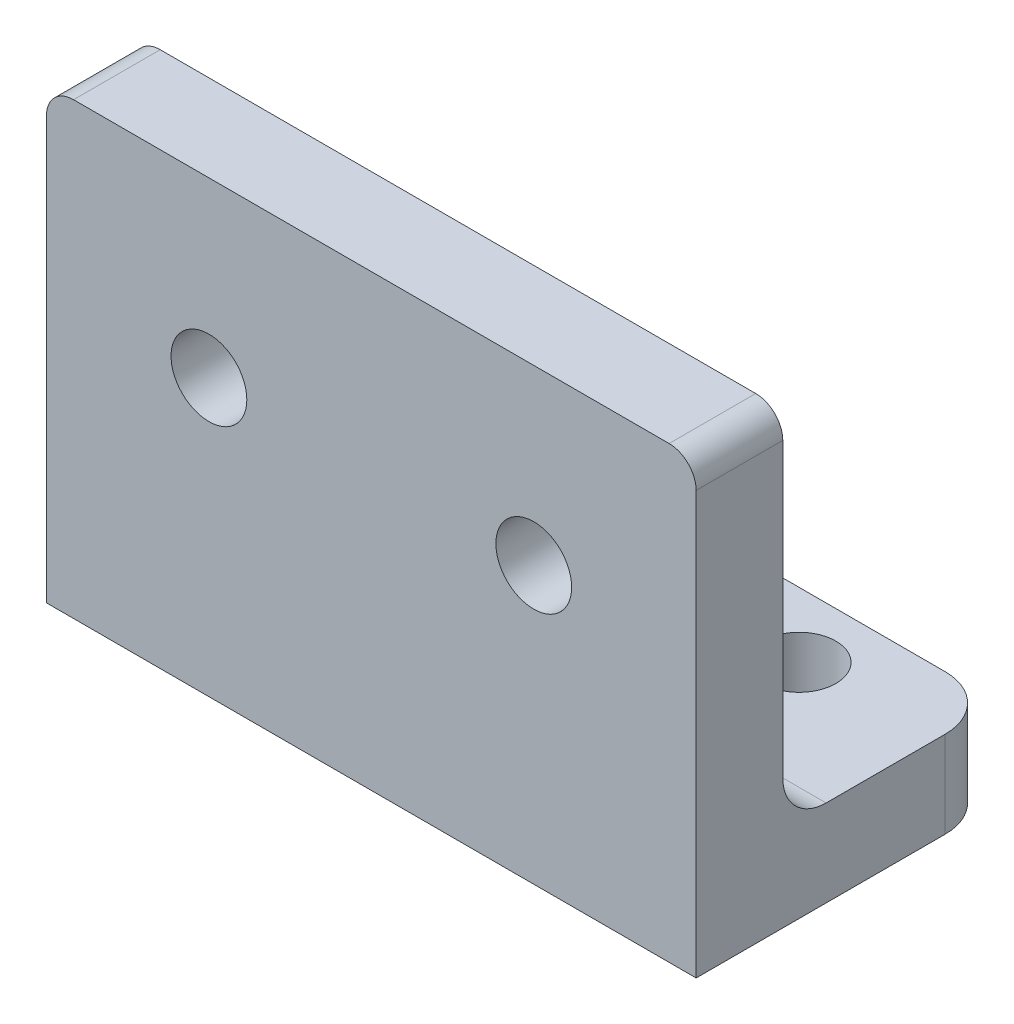
ISO-10303-21;
HEADER;
FILE_DESCRIPTION(('STEP AP214'),'2;1');
FILE_NAME('part.step','',(''),(''),'','','');
FILE_SCHEMA(('AUTOMOTIVE_DESIGN { 1 0 10303 214 1 1 1 1 }'));
ENDSEC;
DATA;
#1=APPLICATION_CONTEXT('core data for automotive mechanical design processes');
#2=APPLICATION_PROTOCOL_DEFINITION('international standard','automotive_design',2000,#1);
#3=PRODUCT_CONTEXT('',#1,'mechanical');
#4=PRODUCT('Part','Part','',(#3));
#5=PRODUCT_RELATED_PRODUCT_CATEGORY('part','',(#4));
#6=PRODUCT_DEFINITION_FORMATION('','',#4);
#7=PRODUCT_DEFINITION_CONTEXT('part definition',#1,'design');
#8=PRODUCT_DEFINITION('design','',#6,#7);
#9=PRODUCT_DEFINITION_SHAPE('','',#8);
#10=(LENGTH_UNIT() NAMED_UNIT(*) SI_UNIT(.MILLI.,.METRE.));
#11=(NAMED_UNIT(*) PLANE_ANGLE_UNIT() SI_UNIT($,.RADIAN.));
#12=(NAMED_UNIT(*) SI_UNIT($,.STERADIAN.) SOLID_ANGLE_UNIT());
#13=UNCERTAINTY_MEASURE_WITH_UNIT(LENGTH_MEASURE(1.E-05),#10,'distance_accuracy_value','');
#14=(GEOMETRIC_REPRESENTATION_CONTEXT(3) GLOBAL_UNCERTAINTY_ASSIGNED_CONTEXT((#13)) GLOBAL_UNIT_ASSIGNED_CONTEXT((#10,
#11,#12)) REPRESENTATION_CONTEXT('',''));
#15=CARTESIAN_POINT('',(0.,0.,0.));
#16=DIRECTION('',(0.,0.,1.));
#17=DIRECTION('',(1.,0.,0.));
#18=AXIS2_PLACEMENT_3D('',#15,#16,#17);
#19=CARTESIAN_POINT('',(0.,0.,0.));
#20=DIRECTION('',(0.,0.,1.));
#21=DIRECTION('',(1.,0.,0.));
#22=AXIS2_PLACEMENT_3D('',#19,#20,#21);
#23=PLANE('',#22);
#24=CARTESIAN_POINT('',(7.49999999999999,2.37499999999999,0.));
#25=DIRECTION('',(0.,0.,1.));
#26=DIRECTION('',(1.,0.,0.));
#27=AXIS2_PLACEMENT_3D('',#24,#25,#26);
#28=CIRCLE('',#27,1.75);
#29=CARTESIAN_POINT('',(9.24999999999999,2.37499999999999,0.));
#30=VERTEX_POINT('',#29);
#31=EDGE_CURVE('E186',#30,#30,#28,.T.);
#32=ORIENTED_EDGE('',*,*,#31,.T.);
#33=EDGE_LOOP('',(#32));
#34=FACE_BOUND('',#33,.T.);
#35=CARTESIAN_POINT('',(-7.49999999999701,2.37499999999999,0.));
#36=DIRECTION('',(0.,0.,1.));
#37=DIRECTION('',(1.,0.,0.));
#38=AXIS2_PLACEMENT_3D('',#35,#36,#37);
#39=CIRCLE('',#38,1.75);
#40=CARTESIAN_POINT('',(-5.74999999999701,2.37499999999999,0.));
#41=VERTEX_POINT('',#40);
#42=EDGE_CURVE('E163',#41,#41,#39,.T.);
#43=ORIENTED_EDGE('',*,*,#42,.T.);
#44=EDGE_LOOP('',(#43));
#45=FACE_BOUND('',#44,.T.);
#46=DIRECTION('',(0.,1.,0.));
#47=VECTOR('',#46,1.);
#48=CARTESIAN_POINT('',(15.,10.375,0.));
#49=LINE('',#48,#47);
#50=CARTESIAN_POINT('',(15.,-4.375,0.));
#51=VERTEX_POINT('',#50);
#52=CARTESIAN_POINT('',(15.,9.125,0.));
#53=VERTEX_POINT('',#52);
#54=EDGE_CURVE('E160',#51,#53,#49,.T.);
#55=ORIENTED_EDGE('',*,*,#54,.F.);
#56=DIRECTION('',(1.,0.,0.));
#57=VECTOR('',#56,1.);
#58=CARTESIAN_POINT('',(-15.,-4.375,0.));
#59=LINE('',#58,#57);
#60=CARTESIAN_POINT('',(-15.,-4.375,0.));
#61=VERTEX_POINT('',#60);
#62=EDGE_CURVE('E66',#51,#61,#59,.F.);
#63=ORIENTED_EDGE('',*,*,#62,.T.);
#64=DIRECTION('',(0.,-1.,0.));
#65=VECTOR('',#64,1.);
#66=CARTESIAN_POINT('',(-15.,10.375,0.));
#67=LINE('',#66,#65);
#68=CARTESIAN_POINT('',(-15.,9.125,0.));
#69=VERTEX_POINT('',#68);
#70=EDGE_CURVE('E166',#69,#61,#67,.T.);
#71=ORIENTED_EDGE('',*,*,#70,.F.);
#72=CARTESIAN_POINT('',(-13.75,9.125,0.));
#73=DIRECTION('',(0.,0.,1.));
#74=DIRECTION('',(1.,0.,0.));
#75=AXIS2_PLACEMENT_3D('',#72,#73,#74);
#76=CIRCLE('',#75,1.25);
#77=CARTESIAN_POINT('',(-13.75,10.375,0.));
#78=VERTEX_POINT('',#77);
#79=EDGE_CURVE('E173',#69,#78,#76,.F.);
#80=ORIENTED_EDGE('',*,*,#79,.T.);
#81=DIRECTION('',(-1.,0.,0.));
#82=VECTOR('',#81,1.);
#83=CARTESIAN_POINT('',(-15.,10.375,0.));
#84=LINE('',#83,#82);
#85=CARTESIAN_POINT('',(13.75,10.375,0.));
#86=VERTEX_POINT('',#85);
#87=EDGE_CURVE('E162',#86,#78,#84,.T.);
#88=ORIENTED_EDGE('',*,*,#87,.F.);
#89=CARTESIAN_POINT('',(13.75,9.125,0.));
#90=DIRECTION('',(0.,0.,1.));
#91=DIRECTION('',(1.,0.,0.));
#92=AXIS2_PLACEMENT_3D('',#89,#90,#91);
#93=CIRCLE('',#92,1.25);
#94=EDGE_CURVE('E175',#86,#53,#93,.F.);
#95=ORIENTED_EDGE('',*,*,#94,.T.);
#96=EDGE_LOOP('',(#55,#63,#71,#80,#88,#95));
#97=FACE_BOUND('',#96,.T.);
#98=ADVANCED_FACE('F45',(#34,#45,#97),#23,.F.);
#99=CARTESIAN_POINT('',(15.,10.375,4.));
#100=DIRECTION('',(-1.,0.,0.));
#101=DIRECTION('',(0.,-1.,0.));
#102=AXIS2_PLACEMENT_3D('',#99,#100,#101);
#103=PLANE('',#102);
#104=DIRECTION('',(0.,0.,-1.));
#105=VECTOR('',#104,1.);
#106=CARTESIAN_POINT('',(15.,-10.375,4.));
#107=LINE('',#106,#105);
#108=CARTESIAN_POINT('',(15.,-10.375,4.));
#109=VERTEX_POINT('',#108);
#110=CARTESIAN_POINT('',(15.,-10.375,-7.5));
#111=VERTEX_POINT('',#110);
#112=EDGE_CURVE('E150',#109,#111,#107,.T.);
#113=ORIENTED_EDGE('',*,*,#112,.T.);
#114=DIRECTION('',(0.,-1.,0.));
#115=VECTOR('',#114,1.);
#116=CARTESIAN_POINT('',(15.,10.375,-7.5));
#117=LINE('',#116,#115);
#118=CARTESIAN_POINT('',(15.,-6.375,-7.5));
#119=VERTEX_POINT('',#118);
#120=EDGE_CURVE('E201',#111,#119,#117,.F.);
#121=ORIENTED_EDGE('',*,*,#120,.T.);
#122=DIRECTION('',(0.,0.,1.));
#123=VECTOR('',#122,1.);
#124=CARTESIAN_POINT('',(15.,-6.375,-10.));
#125=LINE('',#124,#123);
#126=CARTESIAN_POINT('',(15.,-6.375,-2.));
#127=VERTEX_POINT('',#126);
#128=EDGE_CURVE('E216',#119,#127,#125,.T.);
#129=ORIENTED_EDGE('',*,*,#128,.T.);
#130=CARTESIAN_POINT('',(15.,-4.375,-2.));
#131=DIRECTION('',(-1.,0.,0.));
#132=DIRECTION('',(0.,-1.,0.));
#133=AXIS2_PLACEMENT_3D('',#130,#131,#132);
#134=CIRCLE('',#133,2.);
#135=EDGE_CURVE('E53',#127,#51,#134,.T.);
#136=ORIENTED_EDGE('',*,*,#135,.T.);
#137=ORIENTED_EDGE('',*,*,#54,.T.);
#138=DIRECTION('',(0.,0.,-1.));
#139=VECTOR('',#138,1.);
#140=CARTESIAN_POINT('',(15.,9.125,4.));
#141=LINE('',#140,#139);
#142=CARTESIAN_POINT('',(15.,9.125,4.));
#143=VERTEX_POINT('',#142);
#144=EDGE_CURVE('E178',#53,#143,#141,.F.);
#145=ORIENTED_EDGE('',*,*,#144,.T.);
#146=DIRECTION('',(0.,1.,0.));
#147=VECTOR('',#146,1.);
#148=CARTESIAN_POINT('',(15.,10.375,4.));
#149=LINE('',#148,#147);
#150=EDGE_CURVE('E167',#109,#143,#149,.T.);
#151=ORIENTED_EDGE('',*,*,#150,.F.);
#152=EDGE_LOOP('',(#113,#121,#129,#136,#137,#145,#151));
#153=FACE_BOUND('',#152,.T.);
#154=ADVANCED_FACE('F221',(#153),#103,.F.);
#155=CARTESIAN_POINT('',(-15.,10.375,4.));
#156=DIRECTION('',(0.,-1.,0.));
#157=DIRECTION('',(0.,0.,-1.));
#158=AXIS2_PLACEMENT_3D('',#155,#156,#157);
#159=PLANE('',#158);
#160=DIRECTION('',(-1.,0.,0.));
#161=VECTOR('',#160,1.);
#162=CARTESIAN_POINT('',(-15.,10.375,4.));
#163=LINE('',#162,#161);
#164=CARTESIAN_POINT('',(13.75,10.375,4.));
#165=VERTEX_POINT('',#164);
#166=CARTESIAN_POINT('',(-13.75,10.375,4.));
#167=VERTEX_POINT('',#166);
#168=EDGE_CURVE('E139',#165,#167,#163,.T.);
#169=ORIENTED_EDGE('',*,*,#168,.F.);
#170=DIRECTION('',(0.,0.,-1.));
#171=VECTOR('',#170,1.);
#172=CARTESIAN_POINT('',(13.75,10.375,4.));
#173=LINE('',#172,#171);
#174=EDGE_CURVE('E170',#165,#86,#173,.T.);
#175=ORIENTED_EDGE('',*,*,#174,.T.);
#176=ORIENTED_EDGE('',*,*,#87,.T.);
#177=DIRECTION('',(0.,0.,-1.));
#178=VECTOR('',#177,1.);
#179=CARTESIAN_POINT('',(-13.75,10.375,4.));
#180=LINE('',#179,#178);
#181=EDGE_CURVE('E149',#78,#167,#180,.F.);
#182=ORIENTED_EDGE('',*,*,#181,.T.);
#183=EDGE_LOOP('',(#169,#175,#176,#182));
#184=FACE_BOUND('',#183,.T.);
#185=ADVANCED_FACE('F244',(#184),#159,.F.);
#186=CARTESIAN_POINT('',(-15.,10.375,4.));
#187=DIRECTION('',(1.,0.,0.));
#188=DIRECTION('',(0.,1.,0.));
#189=AXIS2_PLACEMENT_3D('',#186,#187,#188);
#190=PLANE('',#189);
#191=DIRECTION('',(0.,0.,1.));
#192=VECTOR('',#191,1.);
#193=CARTESIAN_POINT('',(-15.,-6.375,-10.));
#194=LINE('',#193,#192);
#195=CARTESIAN_POINT('',(-15.,-6.375,-7.5));
#196=VERTEX_POINT('',#195);
#197=CARTESIAN_POINT('',(-15.,-6.375,-2.));
#198=VERTEX_POINT('',#197);
#199=EDGE_CURVE('E218',#196,#198,#194,.T.);
#200=ORIENTED_EDGE('',*,*,#199,.F.);
#201=DIRECTION('',(0.,1.,0.));
#202=VECTOR('',#201,1.);
#203=CARTESIAN_POINT('',(-15.,10.375,-7.5));
#204=LINE('',#203,#202);
#205=CARTESIAN_POINT('',(-15.,-10.375,-7.5));
#206=VERTEX_POINT('',#205);
#207=EDGE_CURVE('E146',#196,#206,#204,.F.);
#208=ORIENTED_EDGE('',*,*,#207,.T.);
#209=DIRECTION('',(0.,0.,-1.));
#210=VECTOR('',#209,1.);
#211=CARTESIAN_POINT('',(-15.,-10.375,4.));
#212=LINE('',#211,#210);
#213=CARTESIAN_POINT('',(-15.,-10.375,4.));
#214=VERTEX_POINT('',#213);
#215=EDGE_CURVE('E142',#214,#206,#212,.T.);
#216=ORIENTED_EDGE('',*,*,#215,.F.);
#217=DIRECTION('',(0.,-1.,0.));
#218=VECTOR('',#217,1.);
#219=CARTESIAN_POINT('',(-15.,10.375,4.));
#220=LINE('',#219,#218);
#221=CARTESIAN_POINT('',(-15.,9.125,4.));
#222=VERTEX_POINT('',#221);
#223=EDGE_CURVE('E126',#222,#214,#220,.T.);
#224=ORIENTED_EDGE('',*,*,#223,.F.);
#225=DIRECTION('',(0.,0.,-1.));
#226=VECTOR('',#225,1.);
#227=CARTESIAN_POINT('',(-15.,9.125,4.));
#228=LINE('',#227,#226);
#229=EDGE_CURVE('E183',#222,#69,#228,.T.);
#230=ORIENTED_EDGE('',*,*,#229,.T.);
#231=ORIENTED_EDGE('',*,*,#70,.T.);
#232=CARTESIAN_POINT('',(-15.,-4.375,-2.));
#233=DIRECTION('',(1.,0.,0.));
#234=DIRECTION('',(0.,1.,0.));
#235=AXIS2_PLACEMENT_3D('',#232,#233,#234);
#236=CIRCLE('',#235,2.);
#237=EDGE_CURVE('E13',#61,#198,#236,.T.);
#238=ORIENTED_EDGE('',*,*,#237,.T.);
#239=EDGE_LOOP('',(#200,#208,#216,#224,#230,#231,#238));
#240=FACE_BOUND('',#239,.T.);
#241=ADVANCED_FACE('F144',(#240),#190,.F.);
#242=CARTESIAN_POINT('',(-15.,-10.375,4.));
#243=DIRECTION('',(0.,1.,0.));
#244=DIRECTION('',(0.,0.,1.));
#245=AXIS2_PLACEMENT_3D('',#242,#243,#244);
#246=PLANE('',#245);
#247=CARTESIAN_POINT('',(8.75,-10.375,-7.));
#248=DIRECTION('',(0.,-1.,0.));
#249=DIRECTION('',(0.,0.,-1.));
#250=AXIS2_PLACEMENT_3D('',#247,#248,#249);
#251=CIRCLE('',#250,1.7);
#252=CARTESIAN_POINT('',(8.75,-10.375,-8.7));
#253=VERTEX_POINT('',#252);
#254=EDGE_CURVE('E266',#253,#253,#251,.T.);
#255=ORIENTED_EDGE('',*,*,#254,.F.);
#256=EDGE_LOOP('',(#255));
#257=FACE_BOUND('',#256,.T.);
#258=CARTESIAN_POINT('',(-8.75,-10.375,-7.));
#259=DIRECTION('',(0.,-1.,0.));
#260=DIRECTION('',(0.,0.,-1.));
#261=AXIS2_PLACEMENT_3D('',#258,#259,#260);
#262=CIRCLE('',#261,1.7);
#263=CARTESIAN_POINT('',(-8.75,-10.375,-8.7));
#264=VERTEX_POINT('',#263);
#265=EDGE_CURVE('E258',#264,#264,#262,.T.);
#266=ORIENTED_EDGE('',*,*,#265,.F.);
#267=EDGE_LOOP('',(#266));
#268=FACE_BOUND('',#267,.T.);
#269=DIRECTION('',(-1.,0.,0.));
#270=VECTOR('',#269,1.);
#271=CARTESIAN_POINT('',(15.,-10.375,-10.));
#272=LINE('',#271,#270);
#273=CARTESIAN_POINT('',(12.5,-10.375,-10.));
#274=VERTEX_POINT('',#273);
#275=CARTESIAN_POINT('',(-12.5,-10.375,-10.));
#276=VERTEX_POINT('',#275);
#277=EDGE_CURVE('E228',#274,#276,#272,.T.);
#278=ORIENTED_EDGE('',*,*,#277,.F.);
#279=CARTESIAN_POINT('',(12.5,-10.375,-7.5));
#280=DIRECTION('',(0.,1.,0.));
#281=DIRECTION('',(0.,0.,1.));
#282=AXIS2_PLACEMENT_3D('',#279,#280,#281);
#283=CIRCLE('',#282,2.5);
#284=EDGE_CURVE('E199',#274,#111,#283,.F.);
#285=ORIENTED_EDGE('',*,*,#284,.T.);
#286=ORIENTED_EDGE('',*,*,#112,.F.);
#287=DIRECTION('',(1.,0.,0.));
#288=VECTOR('',#287,1.);
#289=CARTESIAN_POINT('',(-15.,-10.375,4.));
#290=LINE('',#289,#288);
#291=EDGE_CURVE('E131',#214,#109,#290,.T.);
#292=ORIENTED_EDGE('',*,*,#291,.F.);
#293=ORIENTED_EDGE('',*,*,#215,.T.);
#294=CARTESIAN_POINT('',(-12.5,-10.375,-7.5));
#295=DIRECTION('',(0.,1.,0.));
#296=DIRECTION('',(0.,0.,1.));
#297=AXIS2_PLACEMENT_3D('',#294,#295,#296);
#298=CIRCLE('',#297,2.5);
#299=EDGE_CURVE('E197',#206,#276,#298,.F.);
#300=ORIENTED_EDGE('',*,*,#299,.T.);
#301=EDGE_LOOP('',(#278,#285,#286,#292,#293,#300));
#302=FACE_BOUND('',#301,.T.);
#303=ADVANCED_FACE('F153',(#257,#268,#302),#246,.F.);
#304=CARTESIAN_POINT('',(0.,0.,4.));
#305=DIRECTION('',(0.,0.,1.));
#306=DIRECTION('',(1.,0.,0.));
#307=AXIS2_PLACEMENT_3D('',#304,#305,#306);
#308=PLANE('',#307);
#309=CARTESIAN_POINT('',(-7.49999999999701,2.37499999999999,4.));
#310=DIRECTION('',(0.,0.,1.));
#311=DIRECTION('',(1.,0.,0.));
#312=AXIS2_PLACEMENT_3D('',#309,#310,#311);
#313=CIRCLE('',#312,1.75);
#314=CARTESIAN_POINT('',(-5.74999999999701,2.37499999999999,4.));
#315=VERTEX_POINT('',#314);
#316=EDGE_CURVE('E189',#315,#315,#313,.T.);
#317=ORIENTED_EDGE('',*,*,#316,.F.);
#318=EDGE_LOOP('',(#317));
#319=FACE_BOUND('',#318,.T.);
#320=CARTESIAN_POINT('',(7.49999999999999,2.37499999999999,4.));
#321=DIRECTION('',(0.,0.,1.));
#322=DIRECTION('',(1.,0.,0.));
#323=AXIS2_PLACEMENT_3D('',#320,#321,#322);
#324=CIRCLE('',#323,1.75);
#325=CARTESIAN_POINT('',(9.24999999999999,2.37499999999999,4.));
#326=VERTEX_POINT('',#325);
#327=EDGE_CURVE('E225',#326,#326,#324,.T.);
#328=ORIENTED_EDGE('',*,*,#327,.F.);
#329=EDGE_LOOP('',(#328));
#330=FACE_BOUND('',#329,.T.);
#331=ORIENTED_EDGE('',*,*,#150,.T.);
#332=CARTESIAN_POINT('',(13.75,9.125,4.));
#333=DIRECTION('',(0.,0.,1.));
#334=DIRECTION('',(1.,0.,0.));
#335=AXIS2_PLACEMENT_3D('',#332,#333,#334);
#336=CIRCLE('',#335,1.25);
#337=EDGE_CURVE('E181',#143,#165,#336,.T.);
#338=ORIENTED_EDGE('',*,*,#337,.T.);
#339=ORIENTED_EDGE('',*,*,#168,.T.);
#340=CARTESIAN_POINT('',(-13.75,9.125,4.));
#341=DIRECTION('',(0.,0.,1.));
#342=DIRECTION('',(1.,0.,0.));
#343=AXIS2_PLACEMENT_3D('',#340,#341,#342);
#344=CIRCLE('',#343,1.25);
#345=EDGE_CURVE('E135',#167,#222,#344,.T.);
#346=ORIENTED_EDGE('',*,*,#345,.T.);
#347=ORIENTED_EDGE('',*,*,#223,.T.);
#348=ORIENTED_EDGE('',*,*,#291,.T.);
#349=EDGE_LOOP('',(#331,#338,#339,#346,#347,#348));
#350=FACE_BOUND('',#349,.T.);
#351=ADVANCED_FACE('F129',(#319,#330,#350),#308,.T.);
#352=CARTESIAN_POINT('',(13.75,9.125,4.));
#353=DIRECTION('',(0.,0.,-1.));
#354=DIRECTION('',(-1.,0.,0.));
#355=AXIS2_PLACEMENT_3D('',#352,#353,#354);
#356=CYLINDRICAL_SURFACE('',#355,1.25);
#357=ORIENTED_EDGE('',*,*,#337,.F.);
#358=ORIENTED_EDGE('',*,*,#144,.F.);
#359=ORIENTED_EDGE('',*,*,#94,.F.);
#360=ORIENTED_EDGE('',*,*,#174,.F.);
#361=EDGE_LOOP('',(#357,#358,#359,#360));
#362=FACE_BOUND('',#361,.T.);
#363=ADVANCED_FACE('F246',(#362),#356,.T.);
#364=CARTESIAN_POINT('',(-13.75,9.125,4.));
#365=DIRECTION('',(0.,0.,-1.));
#366=DIRECTION('',(-1.,0.,0.));
#367=AXIS2_PLACEMENT_3D('',#364,#365,#366);
#368=CYLINDRICAL_SURFACE('',#367,1.25);
#369=ORIENTED_EDGE('',*,*,#345,.F.);
#370=ORIENTED_EDGE('',*,*,#181,.F.);
#371=ORIENTED_EDGE('',*,*,#79,.F.);
#372=ORIENTED_EDGE('',*,*,#229,.F.);
#373=EDGE_LOOP('',(#369,#370,#371,#372));
#374=FACE_BOUND('',#373,.T.);
#375=ADVANCED_FACE('F242',(#374),#368,.T.);
#376=CARTESIAN_POINT('',(7.49999999999999,2.37499999999999,-6.));
#377=DIRECTION('',(0.,0.,1.));
#378=DIRECTION('',(1.,0.,0.));
#379=AXIS2_PLACEMENT_3D('',#376,#377,#378);
#380=CYLINDRICAL_SURFACE('',#379,1.75);
#381=ORIENTED_EDGE('',*,*,#327,.T.);
#382=EDGE_LOOP('',(#381));
#383=FACE_BOUND('',#382,.T.);
#384=ORIENTED_EDGE('',*,*,#31,.F.);
#385=EDGE_LOOP('',(#384));
#386=FACE_BOUND('',#385,.T.);
#387=ADVANCED_FACE('F294',(#383,#386),#380,.F.);
#388=CARTESIAN_POINT('',(-7.49999999999701,2.37499999999999,-6.));
#389=DIRECTION('',(0.,0.,1.));
#390=DIRECTION('',(1.,0.,0.));
#391=AXIS2_PLACEMENT_3D('',#388,#389,#390);
#392=CYLINDRICAL_SURFACE('',#391,1.75);
#393=ORIENTED_EDGE('',*,*,#316,.T.);
#394=EDGE_LOOP('',(#393));
#395=FACE_BOUND('',#394,.T.);
#396=ORIENTED_EDGE('',*,*,#42,.F.);
#397=EDGE_LOOP('',(#396));
#398=FACE_BOUND('',#397,.T.);
#399=ADVANCED_FACE('F285',(#395,#398),#392,.F.);
#400=CARTESIAN_POINT('',(15.,-6.375,-10.));
#401=DIRECTION('',(0.,-1.,0.));
#402=DIRECTION('',(0.,0.,-1.));
#403=AXIS2_PLACEMENT_3D('',#400,#401,#402);
#404=PLANE('',#403);
#405=CARTESIAN_POINT('',(8.75,-6.375,-7.));
#406=DIRECTION('',(0.,-1.,0.));
#407=DIRECTION('',(0.,0.,-1.));
#408=AXIS2_PLACEMENT_3D('',#405,#406,#407);
#409=CIRCLE('',#408,1.7);
#410=CARTESIAN_POINT('',(8.75,-6.375,-8.7));
#411=VERTEX_POINT('',#410);
#412=EDGE_CURVE('E263',#411,#411,#409,.T.);
#413=ORIENTED_EDGE('',*,*,#412,.T.);
#414=EDGE_LOOP('',(#413));
#415=FACE_BOUND('',#414,.T.);
#416=CARTESIAN_POINT('',(-8.75,-6.375,-7.));
#417=DIRECTION('',(0.,-1.,0.));
#418=DIRECTION('',(0.,0.,-1.));
#419=AXIS2_PLACEMENT_3D('',#416,#417,#418);
#420=CIRCLE('',#419,1.7);
#421=CARTESIAN_POINT('',(-8.75,-6.375,-8.7));
#422=VERTEX_POINT('',#421);
#423=EDGE_CURVE('E256',#422,#422,#420,.T.);
#424=ORIENTED_EDGE('',*,*,#423,.T.);
#425=EDGE_LOOP('',(#424));
#426=FACE_BOUND('',#425,.T.);
#427=ORIENTED_EDGE('',*,*,#199,.T.);
#428=DIRECTION('',(1.,0.,0.));
#429=VECTOR('',#428,1.);
#430=CARTESIAN_POINT('',(15.,-6.375,-2.));
#431=LINE('',#430,#429);
#432=EDGE_CURVE('E208',#198,#127,#431,.T.);
#433=ORIENTED_EDGE('',*,*,#432,.T.);
#434=ORIENTED_EDGE('',*,*,#128,.F.);
#435=CARTESIAN_POINT('',(12.5,-6.375,-7.5));
#436=DIRECTION('',(0.,-1.,0.));
#437=DIRECTION('',(0.,0.,-1.));
#438=AXIS2_PLACEMENT_3D('',#435,#436,#437);
#439=CIRCLE('',#438,2.5);
#440=CARTESIAN_POINT('',(12.5,-6.375,-10.));
#441=VERTEX_POINT('',#440);
#442=EDGE_CURVE('E205',#119,#441,#439,.F.);
#443=ORIENTED_EDGE('',*,*,#442,.T.);
#444=DIRECTION('',(1.,0.,0.));
#445=VECTOR('',#444,1.);
#446=CARTESIAN_POINT('',(15.,-6.375,-10.));
#447=LINE('',#446,#445);
#448=CARTESIAN_POINT('',(-12.5,-6.375,-10.));
#449=VERTEX_POINT('',#448);
#450=EDGE_CURVE('E223',#449,#441,#447,.T.);
#451=ORIENTED_EDGE('',*,*,#450,.F.);
#452=CARTESIAN_POINT('',(-12.5,-6.375,-7.5));
#453=DIRECTION('',(0.,-1.,0.));
#454=DIRECTION('',(0.,0.,-1.));
#455=AXIS2_PLACEMENT_3D('',#452,#453,#454);
#456=CIRCLE('',#455,2.5);
#457=EDGE_CURVE('E203',#449,#196,#456,.F.);
#458=ORIENTED_EDGE('',*,*,#457,.T.);
#459=EDGE_LOOP('',(#427,#433,#434,#443,#451,#458));
#460=FACE_BOUND('',#459,.T.);
#461=ADVANCED_FACE('F215',(#415,#426,#460),#404,.F.);
#462=CARTESIAN_POINT('',(0.,0.,-10.));
#463=DIRECTION('',(0.,0.,1.));
#464=DIRECTION('',(1.,0.,0.));
#465=AXIS2_PLACEMENT_3D('',#462,#463,#464);
#466=PLANE('',#465);
#467=ORIENTED_EDGE('',*,*,#450,.T.);
#468=DIRECTION('',(0.,-1.,0.));
#469=VECTOR('',#468,1.);
#470=CARTESIAN_POINT('',(12.5,0.,-10.));
#471=LINE('',#470,#469);
#472=EDGE_CURVE('E194',#441,#274,#471,.T.);
#473=ORIENTED_EDGE('',*,*,#472,.T.);
#474=ORIENTED_EDGE('',*,*,#277,.T.);
#475=DIRECTION('',(0.,1.,0.));
#476=VECTOR('',#475,1.);
#477=CARTESIAN_POINT('',(-12.5,0.,-10.));
#478=LINE('',#477,#476);
#479=EDGE_CURVE('E185',#276,#449,#478,.T.);
#480=ORIENTED_EDGE('',*,*,#479,.T.);
#481=EDGE_LOOP('',(#467,#473,#474,#480));
#482=FACE_BOUND('',#481,.T.);
#483=ADVANCED_FACE('F253',(#482),#466,.F.);
#484=CARTESIAN_POINT('',(12.5,0.,-7.5));
#485=DIRECTION('',(0.,-1.,0.));
#486=DIRECTION('',(1.,0.,0.));
#487=AXIS2_PLACEMENT_3D('',#484,#485,#486);
#488=CYLINDRICAL_SURFACE('',#487,2.5);
#489=ORIENTED_EDGE('',*,*,#442,.F.);
#490=ORIENTED_EDGE('',*,*,#120,.F.);
#491=ORIENTED_EDGE('',*,*,#284,.F.);
#492=ORIENTED_EDGE('',*,*,#472,.F.);
#493=EDGE_LOOP('',(#489,#490,#491,#492));
#494=FACE_BOUND('',#493,.T.);
#495=ADVANCED_FACE('F292',(#494),#488,.T.);
#496=CARTESIAN_POINT('',(-12.5,0.,-7.5));
#497=DIRECTION('',(0.,1.,0.));
#498=DIRECTION('',(-1.,0.,0.));
#499=AXIS2_PLACEMENT_3D('',#496,#497,#498);
#500=CYLINDRICAL_SURFACE('',#499,2.5);
#501=ORIENTED_EDGE('',*,*,#299,.F.);
#502=ORIENTED_EDGE('',*,*,#207,.F.);
#503=ORIENTED_EDGE('',*,*,#457,.F.);
#504=ORIENTED_EDGE('',*,*,#479,.F.);
#505=EDGE_LOOP('',(#501,#502,#503,#504));
#506=FACE_BOUND('',#505,.T.);
#507=ADVANCED_FACE('F249',(#506),#500,.T.);
#508=CARTESIAN_POINT('',(15.,-4.375,-2.));
#509=DIRECTION('',(-1.,0.,0.));
#510=DIRECTION('',(0.,0.,1.));
#511=AXIS2_PLACEMENT_3D('',#508,#509,#510);
#512=CYLINDRICAL_SURFACE('',#511,2.);
#513=ORIENTED_EDGE('',*,*,#237,.F.);
#514=ORIENTED_EDGE('',*,*,#62,.F.);
#515=ORIENTED_EDGE('',*,*,#135,.F.);
#516=ORIENTED_EDGE('',*,*,#432,.F.);
#517=EDGE_LOOP('',(#513,#514,#515,#516));
#518=FACE_BOUND('',#517,.T.);
#519=ADVANCED_FACE('F47',(#518),#512,.F.);
#520=CARTESIAN_POINT('',(-8.75,-10.375,-7.));
#521=DIRECTION('',(0.,-1.,0.));
#522=DIRECTION('',(0.,0.,-1.));
#523=AXIS2_PLACEMENT_3D('',#520,#521,#522);
#524=CYLINDRICAL_SURFACE('',#523,1.7);
#525=ORIENTED_EDGE('',*,*,#265,.T.);
#526=EDGE_LOOP('',(#525));
#527=FACE_BOUND('',#526,.T.);
#528=ORIENTED_EDGE('',*,*,#423,.F.);
#529=EDGE_LOOP('',(#528));
#530=FACE_BOUND('',#529,.T.);
#531=ADVANCED_FACE('F278',(#527,#530),#524,.F.);
#532=CARTESIAN_POINT('',(8.75,-10.375,-7.));
#533=DIRECTION('',(0.,-1.,0.));
#534=DIRECTION('',(0.,0.,-1.));
#535=AXIS2_PLACEMENT_3D('',#532,#533,#534);
#536=CYLINDRICAL_SURFACE('',#535,1.7);
#537=ORIENTED_EDGE('',*,*,#254,.T.);
#538=EDGE_LOOP('',(#537));
#539=FACE_BOUND('',#538,.T.);
#540=ORIENTED_EDGE('',*,*,#412,.F.);
#541=EDGE_LOOP('',(#540));
#542=FACE_BOUND('',#541,.T.);
#543=ADVANCED_FACE('F270',(#539,#542),#536,.F.);
#544=CLOSED_SHELL('',(#98,#154,#185,#241,#303,#351,#363,#375,#387,#399,#461,#483,#495,#507,#519,
#531,#543));
#545=MANIFOLD_SOLID_BREP('B2',#544);
#546=ADVANCED_BREP_SHAPE_REPRESENTATION('',(#18,#545),#14);
#547=SHAPE_DEFINITION_REPRESENTATION(#9,#546);
ENDSEC;
END-ISO-10303-21;
